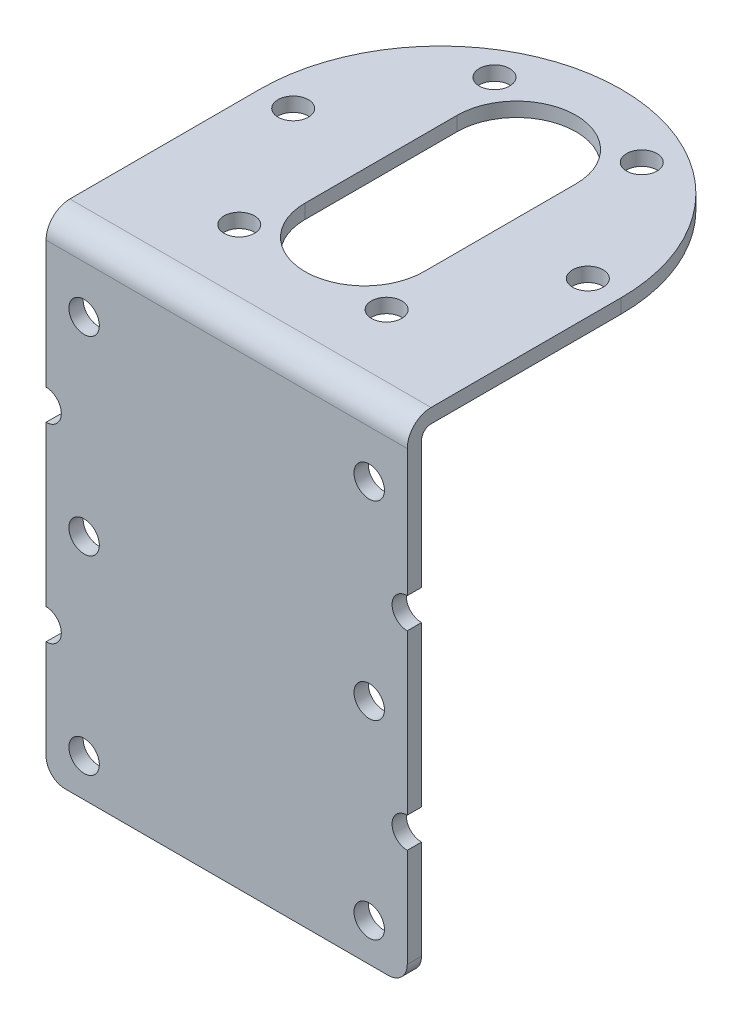
ISO-10303-21;
HEADER;
FILE_DESCRIPTION(('STEP AP214'),'2;1');
FILE_NAME('part.step','',(''),(''),'','','');
FILE_SCHEMA(('AUTOMOTIVE_DESIGN { 1 0 10303 214 1 1 1 1 }'));
ENDSEC;
DATA;
#1=APPLICATION_CONTEXT('core data for automotive mechanical design processes');
#2=APPLICATION_PROTOCOL_DEFINITION('international standard','automotive_design',2000,#1);
#3=PRODUCT_CONTEXT('',#1,'mechanical');
#4=PRODUCT('Part','Part','',(#3));
#5=PRODUCT_RELATED_PRODUCT_CATEGORY('part','',(#4));
#6=PRODUCT_DEFINITION_FORMATION('','',#4);
#7=PRODUCT_DEFINITION_CONTEXT('part definition',#1,'design');
#8=PRODUCT_DEFINITION('design','',#6,#7);
#9=PRODUCT_DEFINITION_SHAPE('','',#8);
#10=(LENGTH_UNIT() NAMED_UNIT(*) SI_UNIT(.MILLI.,.METRE.));
#11=(NAMED_UNIT(*) PLANE_ANGLE_UNIT() SI_UNIT($,.RADIAN.));
#12=(NAMED_UNIT(*) SI_UNIT($,.STERADIAN.) SOLID_ANGLE_UNIT());
#13=UNCERTAINTY_MEASURE_WITH_UNIT(LENGTH_MEASURE(1.E-05),#10,'distance_accuracy_value','');
#14=(GEOMETRIC_REPRESENTATION_CONTEXT(3) GLOBAL_UNCERTAINTY_ASSIGNED_CONTEXT((#13)) GLOBAL_UNIT_ASSIGNED_CONTEXT((#10,
#11,#12)) REPRESENTATION_CONTEXT('',''));
#15=CARTESIAN_POINT('',(0.,0.,0.));
#16=DIRECTION('',(0.,0.,1.));
#17=DIRECTION('',(1.,0.,0.));
#18=AXIS2_PLACEMENT_3D('',#15,#16,#17);
#19=CARTESIAN_POINT('',(0.,0.,-21.));
#20=DIRECTION('',(0.,1.,0.));
#21=DIRECTION('',(0.,0.,1.));
#22=AXIS2_PLACEMENT_3D('',#19,#20,#21);
#23=PLANE('',#22);
#24=DIRECTION('',(0.,0.,-1.));
#25=VECTOR('',#24,1.);
#26=CARTESIAN_POINT('',(19.,0.,0.));
#27=LINE('',#26,#25);
#28=CARTESIAN_POINT('',(19.,0.,-21.));
#29=VERTEX_POINT('',#28);
#30=CARTESIAN_POINT('',(19.,0.,-0.999999999999995));
#31=VERTEX_POINT('',#30);
#32=EDGE_CURVE('E186',#29,#31,#27,.F.);
#33=ORIENTED_EDGE('',*,*,#32,.F.);
#34=CARTESIAN_POINT('',(0.,0.,-21.));
#35=DIRECTION('',(0.,1.,0.));
#36=DIRECTION('',(0.,0.,1.));
#37=AXIS2_PLACEMENT_3D('',#34,#35,#36);
#38=CIRCLE('',#37,19.);
#39=CARTESIAN_POINT('',(-19.,0.,-21.));
#40=VERTEX_POINT('',#39);
#41=EDGE_CURVE('E188',#40,#29,#38,.F.);
#42=ORIENTED_EDGE('',*,*,#41,.F.);
#43=DIRECTION('',(0.,0.,1.));
#44=VECTOR('',#43,1.);
#45=CARTESIAN_POINT('',(-19.,0.,0.));
#46=LINE('',#45,#44);
#47=CARTESIAN_POINT('',(-19.,0.,-0.999999999999995));
#48=VERTEX_POINT('',#47);
#49=EDGE_CURVE('E364',#48,#40,#46,.F.);
#50=ORIENTED_EDGE('',*,*,#49,.F.);
#51=DIRECTION('',(-1.,0.,0.));
#52=VECTOR('',#51,1.);
#53=CARTESIAN_POINT('',(-19.,0.,-0.999999999999994));
#54=LINE('',#53,#52);
#55=EDGE_CURVE('E319',#31,#48,#54,.T.);
#56=ORIENTED_EDGE('',*,*,#55,.F.);
#57=EDGE_LOOP('',(#33,#42,#50,#56));
#58=FACE_BOUND('',#57,.T.);
#59=CARTESIAN_POINT('',(15.5,0.,-21.));
#60=DIRECTION('',(0.,1.,0.));
#61=DIRECTION('',(0.,0.,1.));
#62=AXIS2_PLACEMENT_3D('',#59,#60,#61);
#63=CIRCLE('',#62,1.6);
#64=CARTESIAN_POINT('',(15.5,0.,-19.4));
#65=VERTEX_POINT('',#64);
#66=EDGE_CURVE('E189',#65,#65,#63,.F.);
#67=ORIENTED_EDGE('',*,*,#66,.T.);
#68=EDGE_LOOP('',(#67));
#69=FACE_BOUND('',#68,.T.);
#70=CARTESIAN_POINT('',(7.75000000000001,0.,-7.57660624134121));
#71=DIRECTION('',(0.,1.,0.));
#72=DIRECTION('',(0.,0.,1.));
#73=AXIS2_PLACEMENT_3D('',#70,#71,#72);
#74=CIRCLE('',#73,1.6);
#75=CARTESIAN_POINT('',(7.75000000000001,0.,-5.97660624134121));
#76=VERTEX_POINT('',#75);
#77=EDGE_CURVE('E324',#76,#76,#74,.F.);
#78=ORIENTED_EDGE('',*,*,#77,.T.);
#79=EDGE_LOOP('',(#78));
#80=FACE_BOUND('',#79,.T.);
#81=CARTESIAN_POINT('',(-7.74999999999999,0.,-7.5766062413412));
#82=DIRECTION('',(0.,1.,0.));
#83=DIRECTION('',(0.,0.,1.));
#84=AXIS2_PLACEMENT_3D('',#81,#82,#83);
#85=CIRCLE('',#84,1.6);
#86=CARTESIAN_POINT('',(-7.74999999999999,0.,-5.9766062413412));
#87=VERTEX_POINT('',#86);
#88=EDGE_CURVE('E327',#87,#87,#85,.F.);
#89=ORIENTED_EDGE('',*,*,#88,.T.);
#90=EDGE_LOOP('',(#89));
#91=FACE_BOUND('',#90,.T.);
#92=CARTESIAN_POINT('',(-15.5,0.,-21.));
#93=DIRECTION('',(0.,1.,0.));
#94=DIRECTION('',(0.,0.,1.));
#95=AXIS2_PLACEMENT_3D('',#92,#93,#94);
#96=CIRCLE('',#95,1.6);
#97=CARTESIAN_POINT('',(-15.5,0.,-19.4));
#98=VERTEX_POINT('',#97);
#99=EDGE_CURVE('E330',#98,#98,#96,.F.);
#100=ORIENTED_EDGE('',*,*,#99,.T.);
#101=EDGE_LOOP('',(#100));
#102=FACE_BOUND('',#101,.T.);
#103=CARTESIAN_POINT('',(-7.75000000000001,0.,-34.4233937586588));
#104=DIRECTION('',(0.,1.,0.));
#105=DIRECTION('',(0.,0.,1.));
#106=AXIS2_PLACEMENT_3D('',#103,#104,#105);
#107=CIRCLE('',#106,1.6);
#108=CARTESIAN_POINT('',(-7.75000000000001,0.,-32.8233937586588));
#109=VERTEX_POINT('',#108);
#110=EDGE_CURVE('E333',#109,#109,#107,.F.);
#111=ORIENTED_EDGE('',*,*,#110,.T.);
#112=EDGE_LOOP('',(#111));
#113=FACE_BOUND('',#112,.T.);
#114=CARTESIAN_POINT('',(7.74999999999999,0.,-34.4233937586588));
#115=DIRECTION('',(0.,1.,0.));
#116=DIRECTION('',(0.,0.,1.));
#117=AXIS2_PLACEMENT_3D('',#114,#115,#116);
#118=CIRCLE('',#117,1.6);
#119=CARTESIAN_POINT('',(7.74999999999999,0.,-32.8233937586588));
#120=VERTEX_POINT('',#119);
#121=EDGE_CURVE('E336',#120,#120,#118,.F.);
#122=ORIENTED_EDGE('',*,*,#121,.T.);
#123=EDGE_LOOP('',(#122));
#124=FACE_BOUND('',#123,.T.);
#125=CARTESIAN_POINT('',(0.,0.,-13.));
#126=DIRECTION('',(0.,1.,0.));
#127=DIRECTION('',(0.,0.,1.));
#128=AXIS2_PLACEMENT_3D('',#125,#126,#127);
#129=CIRCLE('',#128,6.25);
#130=CARTESIAN_POINT('',(6.25000000000001,0.,-13.));
#131=VERTEX_POINT('',#130);
#132=CARTESIAN_POINT('',(-6.25,0.,-13.));
#133=VERTEX_POINT('',#132);
#134=EDGE_CURVE('E20',#131,#133,#129,.F.);
#135=ORIENTED_EDGE('',*,*,#134,.T.);
#136=DIRECTION('',(0.,0.,1.));
#137=VECTOR('',#136,1.);
#138=CARTESIAN_POINT('',(-6.25,0.,-29.));
#139=LINE('',#138,#137);
#140=CARTESIAN_POINT('',(-6.25,0.,-29.));
#141=VERTEX_POINT('',#140);
#142=EDGE_CURVE('E163',#133,#141,#139,.F.);
#143=ORIENTED_EDGE('',*,*,#142,.T.);
#144=CARTESIAN_POINT('',(0.,0.,-29.));
#145=DIRECTION('',(0.,1.,0.));
#146=DIRECTION('',(0.,0.,1.));
#147=AXIS2_PLACEMENT_3D('',#144,#145,#146);
#148=CIRCLE('',#147,6.25);
#149=CARTESIAN_POINT('',(6.25,0.,-29.));
#150=VERTEX_POINT('',#149);
#151=EDGE_CURVE('E338',#141,#150,#148,.F.);
#152=ORIENTED_EDGE('',*,*,#151,.T.);
#153=DIRECTION('',(0.,0.,-1.));
#154=VECTOR('',#153,1.);
#155=CARTESIAN_POINT('',(6.25,0.,-29.));
#156=LINE('',#155,#154);
#157=EDGE_CURVE('E166',#150,#131,#156,.F.);
#158=ORIENTED_EDGE('',*,*,#157,.T.);
#159=EDGE_LOOP('',(#135,#143,#152,#158));
#160=FACE_BOUND('',#159,.T.);
#161=ADVANCED_FACE('F17',(#58,#69,#80,#91,#102,#113,#124,#160),#23,.T.);
#162=CARTESIAN_POINT('',(0.,-51.5,-13.));
#163=DIRECTION('',(0.,1.,0.));
#164=DIRECTION('',(0.,0.,1.));
#165=AXIS2_PLACEMENT_3D('',#162,#163,#164);
#166=CYLINDRICAL_SURFACE('',#165,6.25);
#167=CARTESIAN_POINT('',(0.,-1.5,-13.));
#168=DIRECTION('',(0.,1.,0.));
#169=DIRECTION('',(0.,0.,1.));
#170=AXIS2_PLACEMENT_3D('',#167,#168,#169);
#171=CIRCLE('',#170,6.25);
#172=CARTESIAN_POINT('',(6.25,-1.5,-13.));
#173=VERTEX_POINT('',#172);
#174=CARTESIAN_POINT('',(-6.25,-1.5,-13.));
#175=VERTEX_POINT('',#174);
#176=EDGE_CURVE('E181',#173,#175,#171,.F.);
#177=ORIENTED_EDGE('',*,*,#176,.T.);
#178=DIRECTION('',(0.,1.,0.));
#179=VECTOR('',#178,1.);
#180=CARTESIAN_POINT('',(-6.25,-51.5,-13.));
#181=LINE('',#180,#179);
#182=EDGE_CURVE('E171',#175,#133,#181,.T.);
#183=ORIENTED_EDGE('',*,*,#182,.T.);
#184=ORIENTED_EDGE('',*,*,#134,.F.);
#185=DIRECTION('',(0.,1.,0.));
#186=VECTOR('',#185,1.);
#187=CARTESIAN_POINT('',(6.25000000000001,-51.5,-13.));
#188=LINE('',#187,#186);
#189=EDGE_CURVE('E190',#131,#173,#188,.F.);
#190=ORIENTED_EDGE('',*,*,#189,.T.);
#191=EDGE_LOOP('',(#177,#183,#184,#190));
#192=FACE_BOUND('',#191,.T.);
#193=ADVANCED_FACE('F180',(#192),#166,.F.);
#194=CARTESIAN_POINT('',(-6.25,-51.5,-29.));
#195=DIRECTION('',(-1.,0.,0.));
#196=DIRECTION('',(0.,0.,1.));
#197=AXIS2_PLACEMENT_3D('',#194,#195,#196);
#198=PLANE('',#197);
#199=ORIENTED_EDGE('',*,*,#142,.F.);
#200=ORIENTED_EDGE('',*,*,#182,.F.);
#201=DIRECTION('',(0.,0.,1.));
#202=VECTOR('',#201,1.);
#203=CARTESIAN_POINT('',(-6.25,-1.5,-21.));
#204=LINE('',#203,#202);
#205=CARTESIAN_POINT('',(-6.25,-1.5,-29.));
#206=VERTEX_POINT('',#205);
#207=EDGE_CURVE('E315',#175,#206,#204,.F.);
#208=ORIENTED_EDGE('',*,*,#207,.T.);
#209=DIRECTION('',(0.,1.,0.));
#210=VECTOR('',#209,1.);
#211=CARTESIAN_POINT('',(-6.25000000000001,-51.5,-29.));
#212=LINE('',#211,#210);
#213=EDGE_CURVE('E177',#206,#141,#212,.T.);
#214=ORIENTED_EDGE('',*,*,#213,.T.);
#215=EDGE_LOOP('',(#199,#200,#208,#214));
#216=FACE_BOUND('',#215,.T.);
#217=ADVANCED_FACE('F174',(#216),#198,.F.);
#218=CARTESIAN_POINT('',(0.,-51.5,-29.));
#219=DIRECTION('',(0.,1.,0.));
#220=DIRECTION('',(0.,0.,1.));
#221=AXIS2_PLACEMENT_3D('',#218,#219,#220);
#222=CYLINDRICAL_SURFACE('',#221,6.25);
#223=ORIENTED_EDGE('',*,*,#151,.F.);
#224=ORIENTED_EDGE('',*,*,#213,.F.);
#225=CARTESIAN_POINT('',(0.,-1.5,-29.));
#226=DIRECTION('',(0.,1.,0.));
#227=DIRECTION('',(0.,0.,1.));
#228=AXIS2_PLACEMENT_3D('',#225,#226,#227);
#229=CIRCLE('',#228,6.25);
#230=CARTESIAN_POINT('',(6.25,-1.5,-29.));
#231=VERTEX_POINT('',#230);
#232=EDGE_CURVE('E312',#206,#231,#229,.F.);
#233=ORIENTED_EDGE('',*,*,#232,.T.);
#234=DIRECTION('',(0.,1.,0.));
#235=VECTOR('',#234,1.);
#236=CARTESIAN_POINT('',(6.25,-51.5,-29.));
#237=LINE('',#236,#235);
#238=EDGE_CURVE('E191',#231,#150,#237,.T.);
#239=ORIENTED_EDGE('',*,*,#238,.T.);
#240=EDGE_LOOP('',(#223,#224,#233,#239));
#241=FACE_BOUND('',#240,.T.);
#242=ADVANCED_FACE('F473',(#241),#222,.F.);
#243=CARTESIAN_POINT('',(6.25,-51.5,-29.));
#244=DIRECTION('',(1.,0.,0.));
#245=DIRECTION('',(0.,0.,-1.));
#246=AXIS2_PLACEMENT_3D('',#243,#244,#245);
#247=PLANE('',#246);
#248=ORIENTED_EDGE('',*,*,#157,.F.);
#249=ORIENTED_EDGE('',*,*,#238,.F.);
#250=DIRECTION('',(0.,0.,1.));
#251=VECTOR('',#250,1.);
#252=CARTESIAN_POINT('',(6.25,-1.5,-21.));
#253=LINE('',#252,#251);
#254=EDGE_CURVE('E311',#231,#173,#253,.T.);
#255=ORIENTED_EDGE('',*,*,#254,.T.);
#256=ORIENTED_EDGE('',*,*,#189,.F.);
#257=EDGE_LOOP('',(#248,#249,#255,#256));
#258=FACE_BOUND('',#257,.T.);
#259=ADVANCED_FACE('F347',(#258),#247,.F.);
#260=CARTESIAN_POINT('',(7.74999999999999,-51.5,-34.4233937586588));
#261=DIRECTION('',(0.,1.,0.));
#262=DIRECTION('',(0.,0.,1.));
#263=AXIS2_PLACEMENT_3D('',#260,#261,#262);
#264=CYLINDRICAL_SURFACE('',#263,1.6);
#265=CARTESIAN_POINT('',(7.74999999999999,-1.5,-34.4233937586588));
#266=DIRECTION('',(0.,1.,0.));
#267=DIRECTION('',(0.,0.,1.));
#268=AXIS2_PLACEMENT_3D('',#265,#266,#267);
#269=CIRCLE('',#268,1.6);
#270=CARTESIAN_POINT('',(7.74999999999999,-1.5,-32.8233937586588));
#271=VERTEX_POINT('',#270);
#272=EDGE_CURVE('E308',#271,#271,#269,.F.);
#273=ORIENTED_EDGE('',*,*,#272,.T.);
#274=EDGE_LOOP('',(#273));
#275=FACE_BOUND('',#274,.T.);
#276=ORIENTED_EDGE('',*,*,#121,.F.);
#277=EDGE_LOOP('',(#276));
#278=FACE_BOUND('',#277,.T.);
#279=ADVANCED_FACE('F460',(#275,#278),#264,.F.);
#280=CARTESIAN_POINT('',(-7.75000000000001,-51.5,-34.4233937586588));
#281=DIRECTION('',(0.,1.,0.));
#282=DIRECTION('',(0.,0.,1.));
#283=AXIS2_PLACEMENT_3D('',#280,#281,#282);
#284=CYLINDRICAL_SURFACE('',#283,1.6);
#285=CARTESIAN_POINT('',(-7.75000000000001,-1.5,-34.4233937586588));
#286=DIRECTION('',(0.,1.,0.));
#287=DIRECTION('',(0.,0.,1.));
#288=AXIS2_PLACEMENT_3D('',#285,#286,#287);
#289=CIRCLE('',#288,1.6);
#290=CARTESIAN_POINT('',(-7.75000000000001,-1.5,-32.8233937586588));
#291=VERTEX_POINT('',#290);
#292=EDGE_CURVE('E305',#291,#291,#289,.F.);
#293=ORIENTED_EDGE('',*,*,#292,.T.);
#294=EDGE_LOOP('',(#293));
#295=FACE_BOUND('',#294,.T.);
#296=ORIENTED_EDGE('',*,*,#110,.F.);
#297=EDGE_LOOP('',(#296));
#298=FACE_BOUND('',#297,.T.);
#299=ADVANCED_FACE('F462',(#295,#298),#284,.F.);
#300=CARTESIAN_POINT('',(-15.5,-51.5,-21.));
#301=DIRECTION('',(0.,1.,0.));
#302=DIRECTION('',(0.,0.,1.));
#303=AXIS2_PLACEMENT_3D('',#300,#301,#302);
#304=CYLINDRICAL_SURFACE('',#303,1.6);
#305=CARTESIAN_POINT('',(-15.5,-1.5,-21.));
#306=DIRECTION('',(0.,1.,0.));
#307=DIRECTION('',(0.,0.,1.));
#308=AXIS2_PLACEMENT_3D('',#305,#306,#307);
#309=CIRCLE('',#308,1.6);
#310=CARTESIAN_POINT('',(-15.5,-1.5,-19.4));
#311=VERTEX_POINT('',#310);
#312=EDGE_CURVE('E302',#311,#311,#309,.F.);
#313=ORIENTED_EDGE('',*,*,#312,.T.);
#314=EDGE_LOOP('',(#313));
#315=FACE_BOUND('',#314,.T.);
#316=ORIENTED_EDGE('',*,*,#99,.F.);
#317=EDGE_LOOP('',(#316));
#318=FACE_BOUND('',#317,.T.);
#319=ADVANCED_FACE('F470',(#315,#318),#304,.F.);
#320=CARTESIAN_POINT('',(-7.74999999999999,-51.5,-7.5766062413412));
#321=DIRECTION('',(0.,1.,0.));
#322=DIRECTION('',(0.,0.,1.));
#323=AXIS2_PLACEMENT_3D('',#320,#321,#322);
#324=CYLINDRICAL_SURFACE('',#323,1.6);
#325=CARTESIAN_POINT('',(-7.74999999999999,-1.5,-7.5766062413412));
#326=DIRECTION('',(0.,1.,0.));
#327=DIRECTION('',(0.,0.,1.));
#328=AXIS2_PLACEMENT_3D('',#325,#326,#327);
#329=CIRCLE('',#328,1.6);
#330=CARTESIAN_POINT('',(-7.74999999999999,-1.5,-5.9766062413412));
#331=VERTEX_POINT('',#330);
#332=EDGE_CURVE('E299',#331,#331,#329,.F.);
#333=ORIENTED_EDGE('',*,*,#332,.T.);
#334=EDGE_LOOP('',(#333));
#335=FACE_BOUND('',#334,.T.);
#336=ORIENTED_EDGE('',*,*,#88,.F.);
#337=EDGE_LOOP('',(#336));
#338=FACE_BOUND('',#337,.T.);
#339=ADVANCED_FACE('F569',(#335,#338),#324,.F.);
#340=CARTESIAN_POINT('',(7.75000000000001,-51.5,-7.57660624134121));
#341=DIRECTION('',(0.,1.,0.));
#342=DIRECTION('',(0.,0.,1.));
#343=AXIS2_PLACEMENT_3D('',#340,#341,#342);
#344=CYLINDRICAL_SURFACE('',#343,1.6);
#345=CARTESIAN_POINT('',(7.75000000000001,-1.5,-7.57660624134121));
#346=DIRECTION('',(0.,1.,0.));
#347=DIRECTION('',(0.,0.,1.));
#348=AXIS2_PLACEMENT_3D('',#345,#346,#347);
#349=CIRCLE('',#348,1.6);
#350=CARTESIAN_POINT('',(7.75000000000001,-1.5,-5.97660624134121));
#351=VERTEX_POINT('',#350);
#352=EDGE_CURVE('E296',#351,#351,#349,.F.);
#353=ORIENTED_EDGE('',*,*,#352,.T.);
#354=EDGE_LOOP('',(#353));
#355=FACE_BOUND('',#354,.T.);
#356=ORIENTED_EDGE('',*,*,#77,.F.);
#357=EDGE_LOOP('',(#356));
#358=FACE_BOUND('',#357,.T.);
#359=ADVANCED_FACE('F565',(#355,#358),#344,.F.);
#360=CARTESIAN_POINT('',(15.5,-51.5,-21.));
#361=DIRECTION('',(0.,1.,0.));
#362=DIRECTION('',(0.,0.,1.));
#363=AXIS2_PLACEMENT_3D('',#360,#361,#362);
#364=CYLINDRICAL_SURFACE('',#363,1.6);
#365=CARTESIAN_POINT('',(15.5,-1.5,-21.));
#366=DIRECTION('',(0.,1.,0.));
#367=DIRECTION('',(0.,0.,1.));
#368=AXIS2_PLACEMENT_3D('',#365,#366,#367);
#369=CIRCLE('',#368,1.6);
#370=CARTESIAN_POINT('',(15.5,-1.5,-19.4));
#371=VERTEX_POINT('',#370);
#372=EDGE_CURVE('E293',#371,#371,#369,.F.);
#373=ORIENTED_EDGE('',*,*,#372,.T.);
#374=EDGE_LOOP('',(#373));
#375=FACE_BOUND('',#374,.T.);
#376=ORIENTED_EDGE('',*,*,#66,.F.);
#377=EDGE_LOOP('',(#376));
#378=FACE_BOUND('',#377,.T.);
#379=ADVANCED_FACE('F562',(#375,#378),#364,.F.);
#380=CARTESIAN_POINT('',(0.,-1.5,-21.));
#381=DIRECTION('',(0.,1.,0.));
#382=DIRECTION('',(0.,0.,1.));
#383=AXIS2_PLACEMENT_3D('',#380,#381,#382);
#384=CYLINDRICAL_SURFACE('',#383,19.);
#385=CARTESIAN_POINT('',(0.,-1.5,-21.));
#386=DIRECTION('',(0.,1.,0.));
#387=DIRECTION('',(0.,0.,1.));
#388=AXIS2_PLACEMENT_3D('',#385,#386,#387);
#389=CIRCLE('',#388,19.);
#390=CARTESIAN_POINT('',(19.,-1.5,-21.));
#391=VERTEX_POINT('',#390);
#392=CARTESIAN_POINT('',(-19.,-1.5,-21.));
#393=VERTEX_POINT('',#392);
#394=EDGE_CURVE('E289',#391,#393,#389,.T.);
#395=ORIENTED_EDGE('',*,*,#394,.T.);
#396=DIRECTION('',(0.,1.,0.));
#397=VECTOR('',#396,1.);
#398=CARTESIAN_POINT('',(-19.,-1.5,-21.));
#399=LINE('',#398,#397);
#400=EDGE_CURVE('E363',#40,#393,#399,.F.);
#401=ORIENTED_EDGE('',*,*,#400,.F.);
#402=ORIENTED_EDGE('',*,*,#41,.T.);
#403=DIRECTION('',(0.,1.,0.));
#404=VECTOR('',#403,1.);
#405=CARTESIAN_POINT('',(19.,-1.5,-21.));
#406=LINE('',#405,#404);
#407=EDGE_CURVE('E321',#29,#391,#406,.F.);
#408=ORIENTED_EDGE('',*,*,#407,.T.);
#409=EDGE_LOOP('',(#395,#401,#402,#408));
#410=FACE_BOUND('',#409,.T.);
#411=ADVANCED_FACE('F381',(#410),#384,.T.);
#412=CARTESIAN_POINT('',(-19.,-2.5,-0.999999999999997));
#413=DIRECTION('',(-1.,0.,0.));
#414=DIRECTION('',(0.,0.,1.));
#415=AXIS2_PLACEMENT_3D('',#412,#413,#414);
#416=CYLINDRICAL_SURFACE('',#415,2.5);
#417=DIRECTION('',(1.,0.,0.));
#418=VECTOR('',#417,1.);
#419=CARTESIAN_POINT('',(0.,-2.49999999999999,1.5));
#420=LINE('',#419,#418);
#421=CARTESIAN_POINT('',(19.,-2.49999999999999,1.5));
#422=VERTEX_POINT('',#421);
#423=CARTESIAN_POINT('',(-19.,-2.49999999999999,1.50000000000012));
#424=VERTEX_POINT('',#423);
#425=EDGE_CURVE('E284',#422,#424,#420,.F.);
#426=ORIENTED_EDGE('',*,*,#425,.F.);
#427=CARTESIAN_POINT('',(19.,-2.5,-0.999999999999997));
#428=DIRECTION('',(-1.,0.,0.));
#429=DIRECTION('',(0.,0.,1.));
#430=AXIS2_PLACEMENT_3D('',#427,#428,#429);
#431=CIRCLE('',#430,2.5);
#432=EDGE_CURVE('E317',#31,#422,#431,.F.);
#433=ORIENTED_EDGE('',*,*,#432,.F.);
#434=ORIENTED_EDGE('',*,*,#55,.T.);
#435=CARTESIAN_POINT('',(-19.,-2.5,-0.999999999999997));
#436=DIRECTION('',(-1.,0.,0.));
#437=DIRECTION('',(0.,0.,1.));
#438=AXIS2_PLACEMENT_3D('',#435,#436,#437);
#439=CIRCLE('',#438,2.5);
#440=EDGE_CURVE('E285',#48,#424,#439,.F.);
#441=ORIENTED_EDGE('',*,*,#440,.T.);
#442=EDGE_LOOP('',(#426,#433,#434,#441));
#443=FACE_BOUND('',#442,.T.);
#444=ADVANCED_FACE('F444',(#443),#416,.T.);
#445=CARTESIAN_POINT('',(0.,-1.5,-21.));
#446=DIRECTION('',(0.,1.,0.));
#447=DIRECTION('',(0.,0.,1.));
#448=AXIS2_PLACEMENT_3D('',#445,#446,#447);
#449=PLANE('',#448);
#450=DIRECTION('',(0.,0.,1.));
#451=VECTOR('',#450,1.);
#452=CARTESIAN_POINT('',(-19.,-1.5,-21.));
#453=LINE('',#452,#451);
#454=CARTESIAN_POINT('',(-19.,-1.5,-0.999999999999997));
#455=VERTEX_POINT('',#454);
#456=EDGE_CURVE('E288',#393,#455,#453,.T.);
#457=ORIENTED_EDGE('',*,*,#456,.F.);
#458=ORIENTED_EDGE('',*,*,#394,.F.);
#459=DIRECTION('',(0.,0.,1.));
#460=VECTOR('',#459,1.);
#461=CARTESIAN_POINT('',(19.,-1.5,-21.));
#462=LINE('',#461,#460);
#463=CARTESIAN_POINT('',(19.,-1.5,-0.999999999999997));
#464=VERTEX_POINT('',#463);
#465=EDGE_CURVE('E292',#464,#391,#462,.F.);
#466=ORIENTED_EDGE('',*,*,#465,.F.);
#467=DIRECTION('',(-1.,0.,0.));
#468=VECTOR('',#467,1.);
#469=CARTESIAN_POINT('',(-19.,-1.5,-0.999999999999997));
#470=LINE('',#469,#468);
#471=EDGE_CURVE('E255',#464,#455,#470,.T.);
#472=ORIENTED_EDGE('',*,*,#471,.T.);
#473=EDGE_LOOP('',(#457,#458,#466,#472));
#474=FACE_BOUND('',#473,.T.);
#475=ORIENTED_EDGE('',*,*,#372,.F.);
#476=EDGE_LOOP('',(#475));
#477=FACE_BOUND('',#476,.T.);
#478=ORIENTED_EDGE('',*,*,#352,.F.);
#479=EDGE_LOOP('',(#478));
#480=FACE_BOUND('',#479,.T.);
#481=ORIENTED_EDGE('',*,*,#332,.F.);
#482=EDGE_LOOP('',(#481));
#483=FACE_BOUND('',#482,.T.);
#484=ORIENTED_EDGE('',*,*,#312,.F.);
#485=EDGE_LOOP('',(#484));
#486=FACE_BOUND('',#485,.T.);
#487=ORIENTED_EDGE('',*,*,#292,.F.);
#488=EDGE_LOOP('',(#487));
#489=FACE_BOUND('',#488,.T.);
#490=ORIENTED_EDGE('',*,*,#272,.F.);
#491=EDGE_LOOP('',(#490));
#492=FACE_BOUND('',#491,.T.);
#493=ORIENTED_EDGE('',*,*,#232,.F.);
#494=ORIENTED_EDGE('',*,*,#207,.F.);
#495=ORIENTED_EDGE('',*,*,#176,.F.);
#496=ORIENTED_EDGE('',*,*,#254,.F.);
#497=EDGE_LOOP('',(#493,#494,#495,#496));
#498=FACE_BOUND('',#497,.T.);
#499=ADVANCED_FACE('F377',(#474,#477,#480,#483,#486,#489,#492,#498),#449,.F.);
#500=CARTESIAN_POINT('',(0.,0.,1.49999999999999));
#501=DIRECTION('',(0.,0.,1.));
#502=DIRECTION('',(0.,-1.,0.));
#503=AXIS2_PLACEMENT_3D('',#500,#501,#502);
#504=PLANE('',#503);
#505=CARTESIAN_POINT('',(-15.,-7.49999999999999,1.5000000000002));
#506=DIRECTION('',(0.,0.,-1.));
#507=DIRECTION('',(0.,1.,0.));
#508=AXIS2_PLACEMENT_3D('',#505,#506,#507);
#509=CIRCLE('',#508,1.6);
#510=CARTESIAN_POINT('',(-15.,-5.89999999999998,1.5000000000002));
#511=VERTEX_POINT('',#510);
#512=EDGE_CURVE('E266',#511,#511,#509,.T.);
#513=ORIENTED_EDGE('',*,*,#512,.T.);
#514=EDGE_LOOP('',(#513));
#515=FACE_BOUND('',#514,.T.);
#516=CARTESIAN_POINT('',(-15.,-27.5,1.50000000000027));
#517=DIRECTION('',(0.,0.,-1.));
#518=DIRECTION('',(0.,1.,0.));
#519=AXIS2_PLACEMENT_3D('',#516,#517,#518);
#520=CIRCLE('',#519,1.6);
#521=CARTESIAN_POINT('',(-15.,-25.9,1.50000000000027));
#522=VERTEX_POINT('',#521);
#523=EDGE_CURVE('E269',#522,#522,#520,.T.);
#524=ORIENTED_EDGE('',*,*,#523,.T.);
#525=EDGE_LOOP('',(#524));
#526=FACE_BOUND('',#525,.T.);
#527=CARTESIAN_POINT('',(-15.,-47.5,1.50000000000034));
#528=DIRECTION('',(0.,0.,-1.));
#529=DIRECTION('',(0.,1.,0.));
#530=AXIS2_PLACEMENT_3D('',#527,#528,#529);
#531=CIRCLE('',#530,1.6);
#532=CARTESIAN_POINT('',(-15.,-45.9,1.50000000000033));
#533=VERTEX_POINT('',#532);
#534=EDGE_CURVE('E272',#533,#533,#531,.T.);
#535=ORIENTED_EDGE('',*,*,#534,.T.);
#536=EDGE_LOOP('',(#535));
#537=FACE_BOUND('',#536,.T.);
#538=CARTESIAN_POINT('',(15.,-47.5,1.50000000000034));
#539=DIRECTION('',(0.,0.,-1.));
#540=DIRECTION('',(0.,1.,0.));
#541=AXIS2_PLACEMENT_3D('',#538,#539,#540);
#542=CIRCLE('',#541,1.6);
#543=CARTESIAN_POINT('',(15.,-45.9,1.50000000000033));
#544=VERTEX_POINT('',#543);
#545=EDGE_CURVE('E275',#544,#544,#542,.T.);
#546=ORIENTED_EDGE('',*,*,#545,.T.);
#547=EDGE_LOOP('',(#546));
#548=FACE_BOUND('',#547,.T.);
#549=CARTESIAN_POINT('',(15.,-27.5,1.50000000000027));
#550=DIRECTION('',(0.,0.,-1.));
#551=DIRECTION('',(0.,1.,0.));
#552=AXIS2_PLACEMENT_3D('',#549,#550,#551);
#553=CIRCLE('',#552,1.6);
#554=CARTESIAN_POINT('',(15.,-25.9,1.50000000000027));
#555=VERTEX_POINT('',#554);
#556=EDGE_CURVE('E278',#555,#555,#553,.T.);
#557=ORIENTED_EDGE('',*,*,#556,.T.);
#558=EDGE_LOOP('',(#557));
#559=FACE_BOUND('',#558,.T.);
#560=CARTESIAN_POINT('',(15.,-7.49999999999999,1.5000000000002));
#561=DIRECTION('',(0.,0.,-1.));
#562=DIRECTION('',(0.,1.,0.));
#563=AXIS2_PLACEMENT_3D('',#560,#561,#562);
#564=CIRCLE('',#563,1.6);
#565=CARTESIAN_POINT('',(15.,-5.89999999999999,1.5000000000002));
#566=VERTEX_POINT('',#565);
#567=EDGE_CURVE('E281',#566,#566,#564,.T.);
#568=ORIENTED_EDGE('',*,*,#567,.T.);
#569=EDGE_LOOP('',(#568));
#570=FACE_BOUND('',#569,.T.);
#571=DIRECTION('',(0.,1.,0.));
#572=VECTOR('',#571,1.);
#573=CARTESIAN_POINT('',(-19.,-1.49999999999999,1.50000000000017));
#574=LINE('',#573,#572);
#575=CARTESIAN_POINT('',(-19.,-49.5,1.50000000000017));
#576=VERTEX_POINT('',#575);
#577=CARTESIAN_POINT('',(-19.,-39.1,1.50000000000024));
#578=VERTEX_POINT('',#577);
#579=EDGE_CURVE('E420',#576,#578,#574,.T.);
#580=ORIENTED_EDGE('',*,*,#579,.F.);
#581=CARTESIAN_POINT('',(-17.,-49.5,1.50000000000017));
#582=DIRECTION('',(0.,0.,-1.));
#583=DIRECTION('',(0.,1.,0.));
#584=AXIS2_PLACEMENT_3D('',#581,#582,#583);
#585=CIRCLE('',#584,2.);
#586=CARTESIAN_POINT('',(-17.,-51.5,1.50000000000017));
#587=VERTEX_POINT('',#586);
#588=EDGE_CURVE('E239',#587,#576,#585,.T.);
#589=ORIENTED_EDGE('',*,*,#588,.F.);
#590=DIRECTION('',(1.,0.,0.));
#591=VECTOR('',#590,1.);
#592=CARTESIAN_POINT('',(-19.,-51.5,1.50000000000017));
#593=LINE('',#592,#591);
#594=CARTESIAN_POINT('',(17.,-51.5,1.50000000000017));
#595=VERTEX_POINT('',#594);
#596=EDGE_CURVE('E417',#595,#587,#593,.F.);
#597=ORIENTED_EDGE('',*,*,#596,.F.);
#598=CARTESIAN_POINT('',(17.,-49.5,1.50000000000017));
#599=DIRECTION('',(0.,0.,-1.));
#600=DIRECTION('',(0.,1.,0.));
#601=AXIS2_PLACEMENT_3D('',#598,#599,#600);
#602=CIRCLE('',#601,2.);
#603=CARTESIAN_POINT('',(19.,-49.5,1.50000000000024));
#604=VERTEX_POINT('',#603);
#605=EDGE_CURVE('E235',#604,#595,#602,.T.);
#606=ORIENTED_EDGE('',*,*,#605,.F.);
#607=DIRECTION('',(0.,1.,0.));
#608=VECTOR('',#607,1.);
#609=CARTESIAN_POINT('',(19.,-51.5,1.50000000000031));
#610=LINE('',#609,#608);
#611=CARTESIAN_POINT('',(19.,-39.1,1.50000000000031));
#612=VERTEX_POINT('',#611);
#613=EDGE_CURVE('E412',#612,#604,#610,.F.);
#614=ORIENTED_EDGE('',*,*,#613,.F.);
#615=CARTESIAN_POINT('',(19.,-37.5,1.50000000000031));
#616=DIRECTION('',(0.,0.,-1.));
#617=DIRECTION('',(0.,1.,0.));
#618=AXIS2_PLACEMENT_3D('',#615,#616,#617);
#619=CIRCLE('',#618,1.6);
#620=CARTESIAN_POINT('',(19.,-35.9,1.50000000000027));
#621=VERTEX_POINT('',#620);
#622=EDGE_CURVE('E263',#612,#621,#619,.T.);
#623=ORIENTED_EDGE('',*,*,#622,.T.);
#624=DIRECTION('',(0.,1.,0.));
#625=VECTOR('',#624,1.);
#626=CARTESIAN_POINT('',(19.,-51.5,1.50000000000024));
#627=LINE('',#626,#625);
#628=CARTESIAN_POINT('',(19.,-19.1,1.50000000000024));
#629=VERTEX_POINT('',#628);
#630=EDGE_CURVE('E262',#629,#621,#627,.F.);
#631=ORIENTED_EDGE('',*,*,#630,.F.);
#632=CARTESIAN_POINT('',(19.,-17.5,1.50000000000024));
#633=DIRECTION('',(0.,0.,-1.));
#634=DIRECTION('',(0.,1.,0.));
#635=AXIS2_PLACEMENT_3D('',#632,#633,#634);
#636=CIRCLE('',#635,1.6);
#637=CARTESIAN_POINT('',(19.,-15.9,1.50000000000012));
#638=VERTEX_POINT('',#637);
#639=EDGE_CURVE('E259',#629,#638,#636,.T.);
#640=ORIENTED_EDGE('',*,*,#639,.T.);
#641=DIRECTION('',(0.,1.,0.));
#642=VECTOR('',#641,1.);
#643=CARTESIAN_POINT('',(19.,-51.5,1.5));
#644=LINE('',#643,#642);
#645=EDGE_CURVE('E258',#422,#638,#644,.F.);
#646=ORIENTED_EDGE('',*,*,#645,.F.);
#647=ORIENTED_EDGE('',*,*,#425,.T.);
#648=DIRECTION('',(0.,1.,0.));
#649=VECTOR('',#648,1.);
#650=CARTESIAN_POINT('',(-19.,-1.49999999999999,1.50000000000023));
#651=LINE('',#650,#649);
#652=CARTESIAN_POINT('',(-19.,-15.9,1.50000000000023));
#653=VERTEX_POINT('',#652);
#654=EDGE_CURVE('E251',#653,#424,#651,.T.);
#655=ORIENTED_EDGE('',*,*,#654,.F.);
#656=CARTESIAN_POINT('',(-19.,-17.5,1.50000000000024));
#657=DIRECTION('',(0.,0.,-1.));
#658=DIRECTION('',(0.,1.,0.));
#659=AXIS2_PLACEMENT_3D('',#656,#657,#658);
#660=CIRCLE('',#659,1.6);
#661=CARTESIAN_POINT('',(-19.,-19.1,1.50000000000027));
#662=VERTEX_POINT('',#661);
#663=EDGE_CURVE('E248',#653,#662,#660,.T.);
#664=ORIENTED_EDGE('',*,*,#663,.T.);
#665=DIRECTION('',(0.,1.,0.));
#666=VECTOR('',#665,1.);
#667=CARTESIAN_POINT('',(-19.,-1.49999999999999,1.5000000000003));
#668=LINE('',#667,#666);
#669=CARTESIAN_POINT('',(-19.,-35.9,1.5000000000003));
#670=VERTEX_POINT('',#669);
#671=EDGE_CURVE('E247',#670,#662,#668,.T.);
#672=ORIENTED_EDGE('',*,*,#671,.F.);
#673=CARTESIAN_POINT('',(-19.,-37.5,1.50000000000031));
#674=DIRECTION('',(0.,0.,-1.));
#675=DIRECTION('',(0.,1.,0.));
#676=AXIS2_PLACEMENT_3D('',#673,#674,#675);
#677=CIRCLE('',#676,1.6);
#678=EDGE_CURVE('E243',#670,#578,#677,.T.);
#679=ORIENTED_EDGE('',*,*,#678,.T.);
#680=EDGE_LOOP('',(#580,#589,#597,#606,#614,#623,#631,#640,#646,#647,#655,#664,#672,#679));
#681=FACE_BOUND('',#680,.T.);
#682=ADVANCED_FACE('F441',(#515,#526,#537,#548,#559,#570,#681),#504,.T.);
#683=CARTESIAN_POINT('',(15.,-7.49999999999999,1.5000000000002));
#684=DIRECTION('',(0.,0.,-1.));
#685=DIRECTION('',(0.,1.,0.));
#686=AXIS2_PLACEMENT_3D('',#683,#684,#685);
#687=CYLINDRICAL_SURFACE('',#686,1.6);
#688=ORIENTED_EDGE('',*,*,#567,.F.);
#689=EDGE_LOOP('',(#688));
#690=FACE_BOUND('',#689,.T.);
#691=CARTESIAN_POINT('',(15.,-7.5,0.));
#692=DIRECTION('',(0.,0.,-1.));
#693=DIRECTION('',(0.,1.,0.));
#694=AXIS2_PLACEMENT_3D('',#691,#692,#693);
#695=CIRCLE('',#694,1.6);
#696=CARTESIAN_POINT('',(15.,-5.9,0.));
#697=VERTEX_POINT('',#696);
#698=EDGE_CURVE('E231',#697,#697,#695,.T.);
#699=ORIENTED_EDGE('',*,*,#698,.T.);
#700=EDGE_LOOP('',(#699));
#701=FACE_BOUND('',#700,.T.);
#702=ADVANCED_FACE('F548',(#690,#701),#687,.F.);
#703=CARTESIAN_POINT('',(15.,-27.5,1.50000000000027));
#704=DIRECTION('',(0.,0.,-1.));
#705=DIRECTION('',(0.,1.,0.));
#706=AXIS2_PLACEMENT_3D('',#703,#704,#705);
#707=CYLINDRICAL_SURFACE('',#706,1.6);
#708=ORIENTED_EDGE('',*,*,#556,.F.);
#709=EDGE_LOOP('',(#708));
#710=FACE_BOUND('',#709,.T.);
#711=CARTESIAN_POINT('',(15.,-27.5,0.));
#712=DIRECTION('',(0.,0.,-1.));
#713=DIRECTION('',(0.,1.,0.));
#714=AXIS2_PLACEMENT_3D('',#711,#712,#713);
#715=CIRCLE('',#714,1.6);
#716=CARTESIAN_POINT('',(15.,-25.9,0.));
#717=VERTEX_POINT('',#716);
#718=EDGE_CURVE('E228',#717,#717,#715,.T.);
#719=ORIENTED_EDGE('',*,*,#718,.T.);
#720=EDGE_LOOP('',(#719));
#721=FACE_BOUND('',#720,.T.);
#722=ADVANCED_FACE('F544',(#710,#721),#707,.F.);
#723=CARTESIAN_POINT('',(15.,-47.5,1.50000000000034));
#724=DIRECTION('',(0.,0.,-1.));
#725=DIRECTION('',(0.,1.,0.));
#726=AXIS2_PLACEMENT_3D('',#723,#724,#725);
#727=CYLINDRICAL_SURFACE('',#726,1.6);
#728=ORIENTED_EDGE('',*,*,#545,.F.);
#729=EDGE_LOOP('',(#728));
#730=FACE_BOUND('',#729,.T.);
#731=CARTESIAN_POINT('',(15.,-47.5,1.65882932390282E-13));
#732=DIRECTION('',(0.,0.,-1.));
#733=DIRECTION('',(0.,1.,0.));
#734=AXIS2_PLACEMENT_3D('',#731,#732,#733);
#735=CIRCLE('',#734,1.6);
#736=CARTESIAN_POINT('',(15.,-45.9,1.60296562248133E-13));
#737=VERTEX_POINT('',#736);
#738=EDGE_CURVE('E225',#737,#737,#735,.T.);
#739=ORIENTED_EDGE('',*,*,#738,.T.);
#740=EDGE_LOOP('',(#739));
#741=FACE_BOUND('',#740,.T.);
#742=ADVANCED_FACE('F540',(#730,#741),#727,.F.);
#743=CARTESIAN_POINT('',(-15.,-47.5,1.50000000000034));
#744=DIRECTION('',(0.,0.,-1.));
#745=DIRECTION('',(0.,1.,0.));
#746=AXIS2_PLACEMENT_3D('',#743,#744,#745);
#747=CYLINDRICAL_SURFACE('',#746,1.6);
#748=ORIENTED_EDGE('',*,*,#534,.F.);
#749=EDGE_LOOP('',(#748));
#750=FACE_BOUND('',#749,.T.);
#751=CARTESIAN_POINT('',(-15.,-47.5,1.65882932390282E-13));
#752=DIRECTION('',(0.,0.,-1.));
#753=DIRECTION('',(0.,1.,0.));
#754=AXIS2_PLACEMENT_3D('',#751,#752,#753);
#755=CIRCLE('',#754,1.6);
#756=CARTESIAN_POINT('',(-15.,-45.9,1.60296562248133E-13));
#757=VERTEX_POINT('',#756);
#758=EDGE_CURVE('E222',#757,#757,#755,.T.);
#759=ORIENTED_EDGE('',*,*,#758,.T.);
#760=EDGE_LOOP('',(#759));
#761=FACE_BOUND('',#760,.T.);
#762=ADVANCED_FACE('F536',(#750,#761),#747,.F.);
#763=CARTESIAN_POINT('',(-15.,-27.5,1.50000000000027));
#764=DIRECTION('',(0.,0.,-1.));
#765=DIRECTION('',(0.,1.,0.));
#766=AXIS2_PLACEMENT_3D('',#763,#764,#765);
#767=CYLINDRICAL_SURFACE('',#766,1.6);
#768=ORIENTED_EDGE('',*,*,#523,.F.);
#769=EDGE_LOOP('',(#768));
#770=FACE_BOUND('',#769,.T.);
#771=CARTESIAN_POINT('',(-15.,-27.5,0.));
#772=DIRECTION('',(0.,0.,-1.));
#773=DIRECTION('',(0.,1.,0.));
#774=AXIS2_PLACEMENT_3D('',#771,#772,#773);
#775=CIRCLE('',#774,1.6);
#776=CARTESIAN_POINT('',(-15.,-25.9,0.));
#777=VERTEX_POINT('',#776);
#778=EDGE_CURVE('E219',#777,#777,#775,.T.);
#779=ORIENTED_EDGE('',*,*,#778,.T.);
#780=EDGE_LOOP('',(#779));
#781=FACE_BOUND('',#780,.T.);
#782=ADVANCED_FACE('F532',(#770,#781),#767,.F.);
#783=CARTESIAN_POINT('',(-15.,-7.49999999999999,1.5000000000002));
#784=DIRECTION('',(0.,0.,-1.));
#785=DIRECTION('',(0.,1.,0.));
#786=AXIS2_PLACEMENT_3D('',#783,#784,#785);
#787=CYLINDRICAL_SURFACE('',#786,1.6);
#788=ORIENTED_EDGE('',*,*,#512,.F.);
#789=EDGE_LOOP('',(#788));
#790=FACE_BOUND('',#789,.T.);
#791=CARTESIAN_POINT('',(-15.,-7.49999999999999,0.));
#792=DIRECTION('',(0.,0.,-1.));
#793=DIRECTION('',(0.,1.,0.));
#794=AXIS2_PLACEMENT_3D('',#791,#792,#793);
#795=CIRCLE('',#794,1.6);
#796=CARTESIAN_POINT('',(-15.,-5.89999999999999,0.));
#797=VERTEX_POINT('',#796);
#798=EDGE_CURVE('E216',#797,#797,#795,.T.);
#799=ORIENTED_EDGE('',*,*,#798,.T.);
#800=EDGE_LOOP('',(#799));
#801=FACE_BOUND('',#800,.T.);
#802=ADVANCED_FACE('F528',(#790,#801),#787,.F.);
#803=CARTESIAN_POINT('',(19.,-37.5,1.50000000000031));
#804=DIRECTION('',(0.,0.,-1.));
#805=DIRECTION('',(0.,1.,0.));
#806=AXIS2_PLACEMENT_3D('',#803,#804,#805);
#807=CYLINDRICAL_SURFACE('',#806,1.6);
#808=CARTESIAN_POINT('',(19.,-37.5,1.30971622436249E-13));
#809=DIRECTION('',(0.,0.,-1.));
#810=DIRECTION('',(0.,1.,0.));
#811=AXIS2_PLACEMENT_3D('',#808,#809,#810);
#812=CIRCLE('',#811,1.6);
#813=CARTESIAN_POINT('',(19.,-39.1,1.33950246700635E-13));
#814=VERTEX_POINT('',#813);
#815=CARTESIAN_POINT('',(19.,-35.9,1.22751765838949E-13));
#816=VERTEX_POINT('',#815);
#817=EDGE_CURVE('E213',#814,#816,#812,.T.);
#818=ORIENTED_EDGE('',*,*,#817,.T.);
#819=DIRECTION('',(0.,0.,1.));
#820=VECTOR('',#819,1.);
#821=CARTESIAN_POINT('',(19.,-35.9,1.50000000000017));
#822=LINE('',#821,#820);
#823=EDGE_CURVE('E265',#621,#816,#822,.F.);
#824=ORIENTED_EDGE('',*,*,#823,.F.);
#825=ORIENTED_EDGE('',*,*,#622,.F.);
#826=DIRECTION('',(0.,0.,1.));
#827=VECTOR('',#826,1.);
#828=CARTESIAN_POINT('',(19.,-39.1,1.50000000000017));
#829=LINE('',#828,#827);
#830=EDGE_CURVE('E234',#814,#612,#829,.T.);
#831=ORIENTED_EDGE('',*,*,#830,.F.);
#832=EDGE_LOOP('',(#818,#824,#825,#831));
#833=FACE_BOUND('',#832,.T.);
#834=ADVANCED_FACE('F524',(#833),#807,.F.);
#835=CARTESIAN_POINT('',(19.,-51.5,1.50000000000017));
#836=DIRECTION('',(1.,0.,0.));
#837=DIRECTION('',(0.,1.,0.));
#838=AXIS2_PLACEMENT_3D('',#835,#836,#837);
#839=PLANE('',#838);
#840=DIRECTION('',(0.,0.,-1.));
#841=VECTOR('',#840,1.);
#842=CARTESIAN_POINT('',(19.,-19.1,1.50000000000024));
#843=LINE('',#842,#841);
#844=CARTESIAN_POINT('',(19.,-19.1,0.));
#845=VERTEX_POINT('',#844);
#846=EDGE_CURVE('E261',#845,#629,#843,.F.);
#847=ORIENTED_EDGE('',*,*,#846,.T.);
#848=ORIENTED_EDGE('',*,*,#630,.T.);
#849=ORIENTED_EDGE('',*,*,#823,.T.);
#850=DIRECTION('',(0.,-1.,0.));
#851=VECTOR('',#850,1.);
#852=CARTESIAN_POINT('',(19.,0.,0.));
#853=LINE('',#852,#851);
#854=EDGE_CURVE('E212',#816,#845,#853,.F.);
#855=ORIENTED_EDGE('',*,*,#854,.T.);
#856=EDGE_LOOP('',(#847,#848,#849,#855));
#857=FACE_BOUND('',#856,.T.);
#858=ADVANCED_FACE('F520',(#857),#839,.T.);
#859=CARTESIAN_POINT('',(19.,-17.5,1.50000000000024));
#860=DIRECTION('',(0.,0.,-1.));
#861=DIRECTION('',(0.,1.,0.));
#862=AXIS2_PLACEMENT_3D('',#859,#860,#861);
#863=CYLINDRICAL_SURFACE('',#862,1.6);
#864=CARTESIAN_POINT('',(19.,-17.5,0.));
#865=DIRECTION('',(0.,0.,-1.));
#866=DIRECTION('',(0.,1.,0.));
#867=AXIS2_PLACEMENT_3D('',#864,#865,#866);
#868=CIRCLE('',#867,1.6);
#869=CARTESIAN_POINT('',(19.,-15.9,0.));
#870=VERTEX_POINT('',#869);
#871=EDGE_CURVE('E208',#845,#870,#868,.T.);
#872=ORIENTED_EDGE('',*,*,#871,.T.);
#873=DIRECTION('',(0.,0.,1.));
#874=VECTOR('',#873,1.);
#875=CARTESIAN_POINT('',(19.,-15.9,1.50000000000017));
#876=LINE('',#875,#874);
#877=EDGE_CURVE('E359',#638,#870,#876,.F.);
#878=ORIENTED_EDGE('',*,*,#877,.F.);
#879=ORIENTED_EDGE('',*,*,#639,.F.);
#880=ORIENTED_EDGE('',*,*,#846,.F.);
#881=EDGE_LOOP('',(#872,#878,#879,#880));
#882=FACE_BOUND('',#881,.T.);
#883=ADVANCED_FACE('F517',(#882),#863,.F.);
#884=CARTESIAN_POINT('',(19.,-51.5,1.50000000000017));
#885=DIRECTION('',(1.,0.,0.));
#886=DIRECTION('',(0.,1.,0.));
#887=AXIS2_PLACEMENT_3D('',#884,#885,#886);
#888=PLANE('',#887);
#889=DIRECTION('',(0.,-1.,0.));
#890=VECTOR('',#889,1.);
#891=CARTESIAN_POINT('',(19.,0.,0.));
#892=LINE('',#891,#890);
#893=CARTESIAN_POINT('',(19.,-2.49999999999999,0.));
#894=VERTEX_POINT('',#893);
#895=EDGE_CURVE('E211',#870,#894,#892,.F.);
#896=ORIENTED_EDGE('',*,*,#895,.T.);
#897=CARTESIAN_POINT('',(19.,-2.5,-0.999999999999997));
#898=DIRECTION('',(-1.,0.,0.));
#899=DIRECTION('',(0.,0.,1.));
#900=AXIS2_PLACEMENT_3D('',#897,#898,#899);
#901=CIRCLE('',#900,1.);
#902=EDGE_CURVE('E252',#894,#464,#901,.T.);
#903=ORIENTED_EDGE('',*,*,#902,.T.);
#904=ORIENTED_EDGE('',*,*,#465,.T.);
#905=ORIENTED_EDGE('',*,*,#407,.F.);
#906=ORIENTED_EDGE('',*,*,#32,.T.);
#907=ORIENTED_EDGE('',*,*,#432,.T.);
#908=ORIENTED_EDGE('',*,*,#645,.T.);
#909=ORIENTED_EDGE('',*,*,#877,.T.);
#910=EDGE_LOOP('',(#896,#903,#904,#905,#906,#907,#908,#909));
#911=FACE_BOUND('',#910,.T.);
#912=ADVANCED_FACE('F386',(#911),#888,.T.);
#913=CARTESIAN_POINT('',(-19.,-2.5,-0.999999999999997));
#914=DIRECTION('',(-1.,0.,0.));
#915=DIRECTION('',(0.,0.,1.));
#916=AXIS2_PLACEMENT_3D('',#913,#914,#915);
#917=CYLINDRICAL_SURFACE('',#916,1.);
#918=ORIENTED_EDGE('',*,*,#902,.F.);
#919=DIRECTION('',(1.,0.,0.));
#920=VECTOR('',#919,1.);
#921=CARTESIAN_POINT('',(0.,-2.49999999999999,0.));
#922=LINE('',#921,#920);
#923=CARTESIAN_POINT('',(-19.,-2.49999999999999,0.));
#924=VERTEX_POINT('',#923);
#925=EDGE_CURVE('E392',#894,#924,#922,.F.);
#926=ORIENTED_EDGE('',*,*,#925,.T.);
#927=CARTESIAN_POINT('',(-19.,-2.5,-0.999999999999997));
#928=DIRECTION('',(-1.,0.,0.));
#929=DIRECTION('',(0.,0.,1.));
#930=AXIS2_PLACEMENT_3D('',#927,#928,#929);
#931=CIRCLE('',#930,1.);
#932=EDGE_CURVE('E256',#455,#924,#931,.F.);
#933=ORIENTED_EDGE('',*,*,#932,.F.);
#934=ORIENTED_EDGE('',*,*,#471,.F.);
#935=EDGE_LOOP('',(#918,#926,#933,#934));
#936=FACE_BOUND('',#935,.T.);
#937=ADVANCED_FACE('F389',(#936),#917,.F.);
#938=CARTESIAN_POINT('',(-19.,-1.49999999999999,1.5));
#939=DIRECTION('',(-1.,0.,0.));
#940=DIRECTION('',(0.,0.,1.));
#941=AXIS2_PLACEMENT_3D('',#938,#939,#940);
#942=PLANE('',#941);
#943=ORIENTED_EDGE('',*,*,#654,.T.);
#944=ORIENTED_EDGE('',*,*,#440,.F.);
#945=ORIENTED_EDGE('',*,*,#49,.T.);
#946=ORIENTED_EDGE('',*,*,#400,.T.);
#947=ORIENTED_EDGE('',*,*,#456,.T.);
#948=ORIENTED_EDGE('',*,*,#932,.T.);
#949=DIRECTION('',(0.,-1.,0.));
#950=VECTOR('',#949,1.);
#951=CARTESIAN_POINT('',(-19.,0.,0.));
#952=LINE('',#951,#950);
#953=CARTESIAN_POINT('',(-19.,-15.9,0.));
#954=VERTEX_POINT('',#953);
#955=EDGE_CURVE('E207',#924,#954,#952,.T.);
#956=ORIENTED_EDGE('',*,*,#955,.T.);
#957=DIRECTION('',(0.,0.,-1.));
#958=VECTOR('',#957,1.);
#959=CARTESIAN_POINT('',(-19.,-15.9,1.50000000000023));
#960=LINE('',#959,#958);
#961=EDGE_CURVE('E250',#954,#653,#960,.F.);
#962=ORIENTED_EDGE('',*,*,#961,.T.);
#963=EDGE_LOOP('',(#943,#944,#945,#946,#947,#948,#956,#962));
#964=FACE_BOUND('',#963,.T.);
#965=ADVANCED_FACE('F370',(#964),#942,.T.);
#966=CARTESIAN_POINT('',(-19.,-17.5,1.50000000000024));
#967=DIRECTION('',(0.,0.,-1.));
#968=DIRECTION('',(0.,1.,0.));
#969=AXIS2_PLACEMENT_3D('',#966,#967,#968);
#970=CYLINDRICAL_SURFACE('',#969,1.6);
#971=CARTESIAN_POINT('',(-19.,-17.5,0.));
#972=DIRECTION('',(0.,0.,-1.));
#973=DIRECTION('',(0.,1.,0.));
#974=AXIS2_PLACEMENT_3D('',#971,#972,#973);
#975=CIRCLE('',#974,1.6);
#976=CARTESIAN_POINT('',(-19.,-19.1,0.));
#977=VERTEX_POINT('',#976);
#978=EDGE_CURVE('E204',#954,#977,#975,.T.);
#979=ORIENTED_EDGE('',*,*,#978,.T.);
#980=DIRECTION('',(0.,0.,1.));
#981=VECTOR('',#980,1.);
#982=CARTESIAN_POINT('',(-19.,-19.1,1.5));
#983=LINE('',#982,#981);
#984=EDGE_CURVE('E423',#662,#977,#983,.F.);
#985=ORIENTED_EDGE('',*,*,#984,.F.);
#986=ORIENTED_EDGE('',*,*,#663,.F.);
#987=ORIENTED_EDGE('',*,*,#961,.F.);
#988=EDGE_LOOP('',(#979,#985,#986,#987));
#989=FACE_BOUND('',#988,.T.);
#990=ADVANCED_FACE('F506',(#989),#970,.F.);
#991=CARTESIAN_POINT('',(-19.,-1.49999999999999,1.5));
#992=DIRECTION('',(-1.,0.,0.));
#993=DIRECTION('',(0.,0.,1.));
#994=AXIS2_PLACEMENT_3D('',#991,#992,#993);
#995=PLANE('',#994);
#996=DIRECTION('',(0.,0.,-1.));
#997=VECTOR('',#996,1.);
#998=CARTESIAN_POINT('',(-19.,-35.9,1.5000000000003));
#999=LINE('',#998,#997);
#1000=CARTESIAN_POINT('',(-19.,-35.9,1.25359511716712E-13));
#1001=VERTEX_POINT('',#1000);
#1002=EDGE_CURVE('E246',#1001,#670,#999,.F.);
#1003=ORIENTED_EDGE('',*,*,#1002,.T.);
#1004=ORIENTED_EDGE('',*,*,#671,.T.);
#1005=ORIENTED_EDGE('',*,*,#984,.T.);
#1006=DIRECTION('',(0.,-1.,0.));
#1007=VECTOR('',#1006,1.);
#1008=CARTESIAN_POINT('',(-19.,0.,0.));
#1009=LINE('',#1008,#1007);
#1010=EDGE_CURVE('E203',#977,#1001,#1009,.T.);
#1011=ORIENTED_EDGE('',*,*,#1010,.T.);
#1012=EDGE_LOOP('',(#1003,#1004,#1005,#1011));
#1013=FACE_BOUND('',#1012,.T.);
#1014=ADVANCED_FACE('F502',(#1013),#995,.T.);
#1015=CARTESIAN_POINT('',(-19.,-37.5,1.50000000000031));
#1016=DIRECTION('',(0.,0.,-1.));
#1017=DIRECTION('',(0.,1.,0.));
#1018=AXIS2_PLACEMENT_3D('',#1015,#1016,#1017);
#1019=CYLINDRICAL_SURFACE('',#1018,1.6);
#1020=CARTESIAN_POINT('',(-19.,-37.5,1.30971622436249E-13));
#1021=DIRECTION('',(0.,0.,-1.));
#1022=DIRECTION('',(0.,1.,0.));
#1023=AXIS2_PLACEMENT_3D('',#1020,#1021,#1022);
#1024=CIRCLE('',#1023,1.6);
#1025=CARTESIAN_POINT('',(-19.,-39.1,1.33950246700635E-13));
#1026=VERTEX_POINT('',#1025);
#1027=EDGE_CURVE('E200',#1001,#1026,#1024,.T.);
#1028=ORIENTED_EDGE('',*,*,#1027,.T.);
#1029=DIRECTION('',(0.,0.,1.));
#1030=VECTOR('',#1029,1.);
#1031=CARTESIAN_POINT('',(-19.,-39.1,1.5));
#1032=LINE('',#1031,#1030);
#1033=EDGE_CURVE('E242',#578,#1026,#1032,.F.);
#1034=ORIENTED_EDGE('',*,*,#1033,.F.);
#1035=ORIENTED_EDGE('',*,*,#678,.F.);
#1036=ORIENTED_EDGE('',*,*,#1002,.F.);
#1037=EDGE_LOOP('',(#1028,#1034,#1035,#1036));
#1038=FACE_BOUND('',#1037,.T.);
#1039=ADVANCED_FACE('F498',(#1038),#1019,.F.);
#1040=CARTESIAN_POINT('',(-19.,-1.49999999999999,1.5));
#1041=DIRECTION('',(-1.,0.,0.));
#1042=DIRECTION('',(0.,0.,1.));
#1043=AXIS2_PLACEMENT_3D('',#1040,#1041,#1042);
#1044=PLANE('',#1043);
#1045=ORIENTED_EDGE('',*,*,#579,.T.);
#1046=ORIENTED_EDGE('',*,*,#1033,.T.);
#1047=DIRECTION('',(0.,-1.,0.));
#1048=VECTOR('',#1047,1.);
#1049=CARTESIAN_POINT('',(-19.,0.,0.));
#1050=LINE('',#1049,#1048);
#1051=CARTESIAN_POINT('',(-19.,-49.5,1.67611017965812E-13));
#1052=VERTEX_POINT('',#1051);
#1053=EDGE_CURVE('E199',#1026,#1052,#1050,.T.);
#1054=ORIENTED_EDGE('',*,*,#1053,.T.);
#1055=DIRECTION('',(0.,0.,-1.));
#1056=VECTOR('',#1055,1.);
#1057=CARTESIAN_POINT('',(-19.,-49.5,1.50000000000017));
#1058=LINE('',#1057,#1056);
#1059=EDGE_CURVE('E241',#576,#1052,#1058,.T.);
#1060=ORIENTED_EDGE('',*,*,#1059,.F.);
#1061=EDGE_LOOP('',(#1045,#1046,#1054,#1060));
#1062=FACE_BOUND('',#1061,.T.);
#1063=ADVANCED_FACE('F494',(#1062),#1044,.T.);
#1064=CARTESIAN_POINT('',(-17.,-49.5,1.50000000000017));
#1065=DIRECTION('',(0.,0.,-1.));
#1066=DIRECTION('',(0.,1.,0.));
#1067=AXIS2_PLACEMENT_3D('',#1064,#1065,#1066);
#1068=CYLINDRICAL_SURFACE('',#1067,2.);
#1069=CARTESIAN_POINT('',(-17.,-49.5,1.67617655866259E-13));
#1070=DIRECTION('',(0.,0.,-1.));
#1071=DIRECTION('',(0.,1.,0.));
#1072=AXIS2_PLACEMENT_3D('',#1069,#1070,#1071);
#1073=CIRCLE('',#1072,2.);
#1074=CARTESIAN_POINT('',(-17.,-51.5,1.74578584157056E-13));
#1075=VERTEX_POINT('',#1074);
#1076=EDGE_CURVE('E196',#1052,#1075,#1073,.F.);
#1077=ORIENTED_EDGE('',*,*,#1076,.T.);
#1078=DIRECTION('',(0.,0.,-1.));
#1079=VECTOR('',#1078,1.);
#1080=CARTESIAN_POINT('',(-17.,-51.5,1.50000000000017));
#1081=LINE('',#1080,#1079);
#1082=EDGE_CURVE('E238',#587,#1075,#1081,.T.);
#1083=ORIENTED_EDGE('',*,*,#1082,.F.);
#1084=ORIENTED_EDGE('',*,*,#588,.T.);
#1085=ORIENTED_EDGE('',*,*,#1059,.T.);
#1086=EDGE_LOOP('',(#1077,#1083,#1084,#1085));
#1087=FACE_BOUND('',#1086,.T.);
#1088=ADVANCED_FACE('F490',(#1087),#1068,.T.);
#1089=CARTESIAN_POINT('',(-19.,-51.5,1.50000000000017));
#1090=DIRECTION('',(0.,-1.,0.));
#1091=DIRECTION('',(0.,0.,-1.));
#1092=AXIS2_PLACEMENT_3D('',#1089,#1090,#1091);
#1093=PLANE('',#1092);
#1094=ORIENTED_EDGE('',*,*,#596,.T.);
#1095=ORIENTED_EDGE('',*,*,#1082,.T.);
#1096=DIRECTION('',(1.,0.,0.));
#1097=VECTOR('',#1096,1.);
#1098=CARTESIAN_POINT('',(0.,-51.5,1.74574066942157E-13));
#1099=LINE('',#1098,#1097);
#1100=CARTESIAN_POINT('',(17.,-51.5,1.74578584157056E-13));
#1101=VERTEX_POINT('',#1100);
#1102=EDGE_CURVE('E195',#1075,#1101,#1099,.T.);
#1103=ORIENTED_EDGE('',*,*,#1102,.T.);
#1104=DIRECTION('',(0.,0.,-1.));
#1105=VECTOR('',#1104,1.);
#1106=CARTESIAN_POINT('',(17.,-51.5,1.50000000000017));
#1107=LINE('',#1106,#1105);
#1108=EDGE_CURVE('E237',#595,#1101,#1107,.T.);
#1109=ORIENTED_EDGE('',*,*,#1108,.F.);
#1110=EDGE_LOOP('',(#1094,#1095,#1103,#1109));
#1111=FACE_BOUND('',#1110,.T.);
#1112=ADVANCED_FACE('F486',(#1111),#1093,.T.);
#1113=CARTESIAN_POINT('',(17.,-49.5,1.50000000000017));
#1114=DIRECTION('',(0.,0.,-1.));
#1115=DIRECTION('',(0.,1.,0.));
#1116=AXIS2_PLACEMENT_3D('',#1113,#1114,#1115);
#1117=CYLINDRICAL_SURFACE('',#1116,2.);
#1118=CARTESIAN_POINT('',(17.,-49.5,1.67617655866259E-13));
#1119=DIRECTION('',(0.,0.,-1.));
#1120=DIRECTION('',(0.,1.,0.));
#1121=AXIS2_PLACEMENT_3D('',#1118,#1119,#1120);
#1122=CIRCLE('',#1121,2.);
#1123=CARTESIAN_POINT('',(19.,-49.5,1.67611017965812E-13));
#1124=VERTEX_POINT('',#1123);
#1125=EDGE_CURVE('E26',#1101,#1124,#1122,.F.);
#1126=ORIENTED_EDGE('',*,*,#1125,.T.);
#1127=DIRECTION('',(0.,0.,1.));
#1128=VECTOR('',#1127,1.);
#1129=CARTESIAN_POINT('',(19.,-49.5,1.50000000000017));
#1130=LINE('',#1129,#1128);
#1131=EDGE_CURVE('E34',#604,#1124,#1130,.F.);
#1132=ORIENTED_EDGE('',*,*,#1131,.F.);
#1133=ORIENTED_EDGE('',*,*,#605,.T.);
#1134=ORIENTED_EDGE('',*,*,#1108,.T.);
#1135=EDGE_LOOP('',(#1126,#1132,#1133,#1134));
#1136=FACE_BOUND('',#1135,.T.);
#1137=ADVANCED_FACE('F481',(#1136),#1117,.T.);
#1138=CARTESIAN_POINT('',(19.,-51.5,1.50000000000017));
#1139=DIRECTION('',(1.,0.,0.));
#1140=DIRECTION('',(0.,1.,0.));
#1141=AXIS2_PLACEMENT_3D('',#1138,#1139,#1140);
#1142=PLANE('',#1141);
#1143=DIRECTION('',(0.,-1.,0.));
#1144=VECTOR('',#1143,1.);
#1145=CARTESIAN_POINT('',(19.,0.,0.));
#1146=LINE('',#1145,#1144);
#1147=EDGE_CURVE('E10',#1124,#814,#1146,.F.);
#1148=ORIENTED_EDGE('',*,*,#1147,.T.);
#1149=ORIENTED_EDGE('',*,*,#830,.T.);
#1150=ORIENTED_EDGE('',*,*,#613,.T.);
#1151=ORIENTED_EDGE('',*,*,#1131,.T.);
#1152=EDGE_LOOP('',(#1148,#1149,#1150,#1151));
#1153=FACE_BOUND('',#1152,.T.);
#1154=ADVANCED_FACE('F476',(#1153),#1142,.T.);
#1155=CARTESIAN_POINT('',(0.,0.,0.));
#1156=DIRECTION('',(0.,0.,1.));
#1157=DIRECTION('',(0.,-1.,0.));
#1158=AXIS2_PLACEMENT_3D('',#1155,#1156,#1157);
#1159=PLANE('',#1158);
#1160=ORIENTED_EDGE('',*,*,#1125,.F.);
#1161=ORIENTED_EDGE('',*,*,#1102,.F.);
#1162=ORIENTED_EDGE('',*,*,#1076,.F.);
#1163=ORIENTED_EDGE('',*,*,#1053,.F.);
#1164=ORIENTED_EDGE('',*,*,#1027,.F.);
#1165=ORIENTED_EDGE('',*,*,#1010,.F.);
#1166=ORIENTED_EDGE('',*,*,#978,.F.);
#1167=ORIENTED_EDGE('',*,*,#955,.F.);
#1168=ORIENTED_EDGE('',*,*,#925,.F.);
#1169=ORIENTED_EDGE('',*,*,#895,.F.);
#1170=ORIENTED_EDGE('',*,*,#871,.F.);
#1171=ORIENTED_EDGE('',*,*,#854,.F.);
#1172=ORIENTED_EDGE('',*,*,#817,.F.);
#1173=ORIENTED_EDGE('',*,*,#1147,.F.);
#1174=EDGE_LOOP('',(#1160,#1161,#1162,#1163,#1164,#1165,#1166,#1167,#1168,#1169,#1170,#1171,
#1172,#1173));
#1175=FACE_BOUND('',#1174,.T.);
#1176=ORIENTED_EDGE('',*,*,#798,.F.);
#1177=EDGE_LOOP('',(#1176));
#1178=FACE_BOUND('',#1177,.T.);
#1179=ORIENTED_EDGE('',*,*,#778,.F.);
#1180=EDGE_LOOP('',(#1179));
#1181=FACE_BOUND('',#1180,.T.);
#1182=ORIENTED_EDGE('',*,*,#758,.F.);
#1183=EDGE_LOOP('',(#1182));
#1184=FACE_BOUND('',#1183,.T.);
#1185=ORIENTED_EDGE('',*,*,#738,.F.);
#1186=EDGE_LOOP('',(#1185));
#1187=FACE_BOUND('',#1186,.T.);
#1188=ORIENTED_EDGE('',*,*,#718,.F.);
#1189=EDGE_LOOP('',(#1188));
#1190=FACE_BOUND('',#1189,.T.);
#1191=ORIENTED_EDGE('',*,*,#698,.F.);
#1192=EDGE_LOOP('',(#1191));
#1193=FACE_BOUND('',#1192,.T.);
#1194=ADVANCED_FACE('F399',(#1175,#1178,#1181,#1184,#1187,#1190,#1193),#1159,.F.);
#1195=CLOSED_SHELL('',(#161,#193,#217,#242,#259,#279,#299,#319,#339,#359,#379,#411,#444,#499,
#682,#702,#722,#742,#762,#782,#802,#834,#858,#883,#912,#937,#965,#990,#1014,#1039,#1063,#1088,
#1112,#1137,#1154,#1194));
#1196=MANIFOLD_SOLID_BREP('B1',#1195);
#1197=ADVANCED_BREP_SHAPE_REPRESENTATION('',(#18,#1196),#14);
#1198=SHAPE_DEFINITION_REPRESENTATION(#9,#1197);
ENDSEC;
END-ISO-10303-21;
